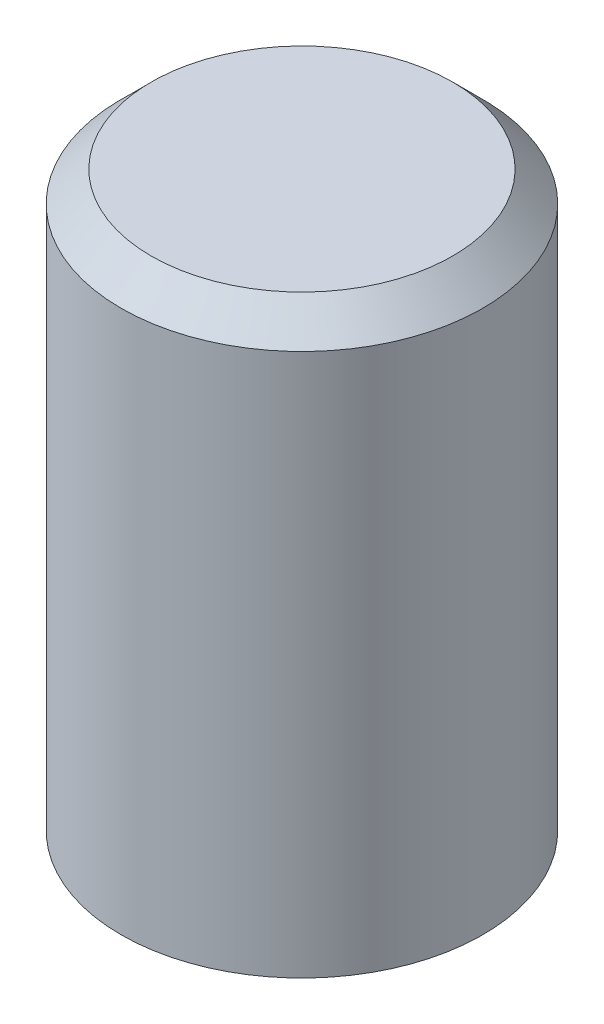
ISO-10303-21;
HEADER;
FILE_DESCRIPTION(('STEP AP214'),'2;1');
FILE_NAME('part.step','',(''),(''),'','','');
FILE_SCHEMA(('AUTOMOTIVE_DESIGN { 1 0 10303 214 1 1 1 1 }'));
ENDSEC;
DATA;
#1=APPLICATION_CONTEXT('core data for automotive mechanical design processes');
#2=APPLICATION_PROTOCOL_DEFINITION('international standard','automotive_design',2000,#1);
#3=PRODUCT_CONTEXT('',#1,'mechanical');
#4=PRODUCT('Part','Part','',(#3));
#5=PRODUCT_RELATED_PRODUCT_CATEGORY('part','',(#4));
#6=PRODUCT_DEFINITION_FORMATION('','',#4);
#7=PRODUCT_DEFINITION_CONTEXT('part definition',#1,'design');
#8=PRODUCT_DEFINITION('design','',#6,#7);
#9=PRODUCT_DEFINITION_SHAPE('','',#8);
#10=(LENGTH_UNIT() NAMED_UNIT(*) SI_UNIT(.MILLI.,.METRE.));
#11=(NAMED_UNIT(*) PLANE_ANGLE_UNIT() SI_UNIT($,.RADIAN.));
#12=(NAMED_UNIT(*) SI_UNIT($,.STERADIAN.) SOLID_ANGLE_UNIT());
#13=UNCERTAINTY_MEASURE_WITH_UNIT(LENGTH_MEASURE(1.E-05),#10,'distance_accuracy_value','');
#14=(GEOMETRIC_REPRESENTATION_CONTEXT(3) GLOBAL_UNCERTAINTY_ASSIGNED_CONTEXT((#13)) GLOBAL_UNIT_ASSIGNED_CONTEXT((#10,
#11,#12)) REPRESENTATION_CONTEXT('',''));
#15=CARTESIAN_POINT('',(0.,0.,0.));
#16=DIRECTION('',(0.,0.,1.));
#17=DIRECTION('',(1.,0.,0.));
#18=AXIS2_PLACEMENT_3D('',#15,#16,#17);
#19=CARTESIAN_POINT('',(0.,9.5,0.));
#20=DIRECTION('',(0.,-1.,0.));
#21=DIRECTION('',(0.,0.,-1.));
#22=AXIS2_PLACEMENT_3D('',#19,#20,#21);
#23=CYLINDRICAL_SURFACE('',#22,3.);
#24=CARTESIAN_POINT('',(0.,9.,0.));
#25=DIRECTION('',(0.,1.,0.));
#26=DIRECTION('',(0.,0.,1.));
#27=AXIS2_PLACEMENT_3D('',#24,#25,#26);
#28=CIRCLE('',#27,3.);
#29=CARTESIAN_POINT('',(0.,9.,3.));
#30=VERTEX_POINT('',#29);
#31=EDGE_CURVE('E10',#30,#30,#28,.F.);
#32=ORIENTED_EDGE('',*,*,#31,.T.);
#33=EDGE_LOOP('',(#32));
#34=FACE_BOUND('',#33,.T.);
#35=CARTESIAN_POINT('',(0.,0.,0.));
#36=DIRECTION('',(0.,1.,0.));
#37=DIRECTION('',(0.,0.,1.));
#38=AXIS2_PLACEMENT_3D('',#35,#36,#37);
#39=CIRCLE('',#38,3.);
#40=CARTESIAN_POINT('',(0.,0.,3.));
#41=VERTEX_POINT('',#40);
#42=EDGE_CURVE('E41',#41,#41,#39,.T.);
#43=ORIENTED_EDGE('',*,*,#42,.T.);
#44=EDGE_LOOP('',(#43));
#45=FACE_BOUND('',#44,.T.);
#46=ADVANCED_FACE('F30',(#34,#45),#23,.T.);
#47=CARTESIAN_POINT('',(0.,9.5,0.));
#48=DIRECTION('',(0.,1.,0.));
#49=DIRECTION('',(0.,0.,1.));
#50=AXIS2_PLACEMENT_3D('',#47,#48,#49);
#51=PLANE('',#50);
#52=CARTESIAN_POINT('',(0.,9.5,0.));
#53=DIRECTION('',(0.,1.,0.));
#54=DIRECTION('',(0.,0.,1.));
#55=AXIS2_PLACEMENT_3D('',#52,#53,#54);
#56=CIRCLE('',#55,2.5);
#57=CARTESIAN_POINT('',(0.,9.5,2.5));
#58=VERTEX_POINT('',#57);
#59=EDGE_CURVE('E37',#58,#58,#56,.T.);
#60=ORIENTED_EDGE('',*,*,#59,.T.);
#61=EDGE_LOOP('',(#60));
#62=FACE_BOUND('',#61,.T.);
#63=ADVANCED_FACE('F51',(#62),#51,.T.);
#64=CARTESIAN_POINT('',(0.,0.,0.));
#65=DIRECTION('',(0.,1.,0.));
#66=DIRECTION('',(0.,0.,1.));
#67=AXIS2_PLACEMENT_3D('',#64,#65,#66);
#68=PLANE('',#67);
#69=ORIENTED_EDGE('',*,*,#42,.F.);
#70=EDGE_LOOP('',(#69));
#71=FACE_BOUND('',#70,.T.);
#72=ADVANCED_FACE('F49',(#71),#68,.F.);
#73=CARTESIAN_POINT('',(0.,9.5,0.));
#74=DIRECTION('',(0.,-1.,0.));
#75=DIRECTION('',(0.,0.,-1.));
#76=AXIS2_PLACEMENT_3D('',#73,#74,#75);
#77=CONICAL_SURFACE('',#76,2.5,0.785398163397447);
#78=ORIENTED_EDGE('',*,*,#31,.F.);
#79=EDGE_LOOP('',(#78));
#80=FACE_BOUND('',#79,.T.);
#81=ORIENTED_EDGE('',*,*,#59,.F.);
#82=EDGE_LOOP('',(#81));
#83=FACE_BOUND('',#82,.T.);
#84=ADVANCED_FACE('F32',(#80,#83),#77,.T.);
#85=CLOSED_SHELL('',(#46,#63,#72,#84));
#86=MANIFOLD_SOLID_BREP('B2',#85);
#87=ADVANCED_BREP_SHAPE_REPRESENTATION('',(#18,#86),#14);
#88=SHAPE_DEFINITION_REPRESENTATION(#9,#87);
ENDSEC;
END-ISO-10303-21;
